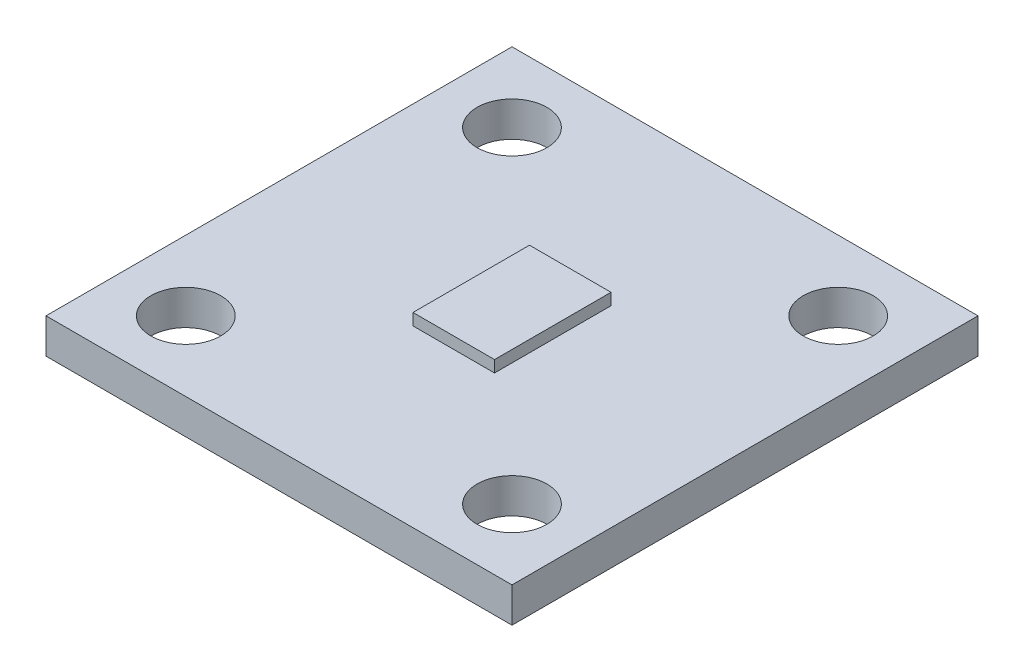
ISO-10303-21;
HEADER;
FILE_DESCRIPTION(('STEP AP214'),'2;1');
FILE_NAME('part.step','',(''),(''),'','','');
FILE_SCHEMA(('AUTOMOTIVE_DESIGN { 1 0 10303 214 1 1 1 1 }'));
ENDSEC;
DATA;
#1=APPLICATION_CONTEXT('core data for automotive mechanical design processes');
#2=APPLICATION_PROTOCOL_DEFINITION('international standard','automotive_design',2000,#1);
#3=PRODUCT_CONTEXT('',#1,'mechanical');
#4=PRODUCT('Part','Part','',(#3));
#5=PRODUCT_RELATED_PRODUCT_CATEGORY('part','',(#4));
#6=PRODUCT_DEFINITION_FORMATION('','',#4);
#7=PRODUCT_DEFINITION_CONTEXT('part definition',#1,'design');
#8=PRODUCT_DEFINITION('design','',#6,#7);
#9=PRODUCT_DEFINITION_SHAPE('','',#8);
#10=(LENGTH_UNIT() NAMED_UNIT(*) SI_UNIT(.MILLI.,.METRE.));
#11=(NAMED_UNIT(*) PLANE_ANGLE_UNIT() SI_UNIT($,.RADIAN.));
#12=(NAMED_UNIT(*) SI_UNIT($,.STERADIAN.) SOLID_ANGLE_UNIT());
#13=UNCERTAINTY_MEASURE_WITH_UNIT(LENGTH_MEASURE(1.E-05),#10,'distance_accuracy_value','');
#14=(GEOMETRIC_REPRESENTATION_CONTEXT(3) GLOBAL_UNCERTAINTY_ASSIGNED_CONTEXT((#13)) GLOBAL_UNIT_ASSIGNED_CONTEXT((#10,
#11,#12)) REPRESENTATION_CONTEXT('',''));
#15=CARTESIAN_POINT('',(0.,0.,0.));
#16=DIRECTION('',(0.,0.,1.));
#17=DIRECTION('',(1.,0.,0.));
#18=AXIS2_PLACEMENT_3D('',#15,#16,#17);
#19=CARTESIAN_POINT('',(0.,1.5,0.));
#20=DIRECTION('',(0.,-1.,0.));
#21=DIRECTION('',(0.,0.,-1.));
#22=AXIS2_PLACEMENT_3D('',#19,#20,#21);
#23=PLANE('',#22);
#24=CARTESIAN_POINT('',(3.,1.5,-3.));
#25=DIRECTION('',(0.,1.,0.));
#26=DIRECTION('',(0.,0.,-1.));
#27=AXIS2_PLACEMENT_3D('',#24,#25,#26);
#28=CIRCLE('',#27,1.5);
#29=CARTESIAN_POINT('',(3.,1.5,-4.5));
#30=VERTEX_POINT('',#29);
#31=EDGE_CURVE('E137',#30,#30,#28,.T.);
#32=ORIENTED_EDGE('',*,*,#31,.F.);
#33=EDGE_LOOP('',(#32));
#34=FACE_BOUND('',#33,.T.);
#35=CARTESIAN_POINT('',(17.,1.5,-3.));
#36=DIRECTION('',(0.,1.,0.));
#37=DIRECTION('',(0.,0.,1.));
#38=AXIS2_PLACEMENT_3D('',#35,#36,#37);
#39=CIRCLE('',#38,1.5);
#40=CARTESIAN_POINT('',(17.,1.5,-1.5));
#41=VERTEX_POINT('',#40);
#42=EDGE_CURVE('E146',#41,#41,#39,.T.);
#43=ORIENTED_EDGE('',*,*,#42,.F.);
#44=EDGE_LOOP('',(#43));
#45=FACE_BOUND('',#44,.T.);
#46=CARTESIAN_POINT('',(17.,1.5,-17.));
#47=DIRECTION('',(0.,1.,0.));
#48=DIRECTION('',(0.,0.,-1.));
#49=AXIS2_PLACEMENT_3D('',#46,#47,#48);
#50=CIRCLE('',#49,1.5);
#51=CARTESIAN_POINT('',(17.,1.5,-18.5));
#52=VERTEX_POINT('',#51);
#53=EDGE_CURVE('E160',#52,#52,#50,.T.);
#54=ORIENTED_EDGE('',*,*,#53,.F.);
#55=EDGE_LOOP('',(#54));
#56=FACE_BOUND('',#55,.T.);
#57=CARTESIAN_POINT('',(3.,1.5,-17.));
#58=DIRECTION('',(0.,1.,0.));
#59=DIRECTION('',(0.,0.,1.));
#60=AXIS2_PLACEMENT_3D('',#57,#58,#59);
#61=CIRCLE('',#60,1.5);
#62=CARTESIAN_POINT('',(3.,1.5,-15.5));
#63=VERTEX_POINT('',#62);
#64=EDGE_CURVE('E164',#63,#63,#61,.T.);
#65=ORIENTED_EDGE('',*,*,#64,.F.);
#66=EDGE_LOOP('',(#65));
#67=FACE_BOUND('',#66,.T.);
#68=DIRECTION('',(0.,0.,1.));
#69=VECTOR('',#68,1.);
#70=CARTESIAN_POINT('',(0.,1.5,0.));
#71=LINE('',#70,#69);
#72=CARTESIAN_POINT('',(0.,1.5,-20.));
#73=VERTEX_POINT('',#72);
#74=CARTESIAN_POINT('',(0.,1.5,0.));
#75=VERTEX_POINT('',#74);
#76=EDGE_CURVE('E171',#73,#75,#71,.T.);
#77=ORIENTED_EDGE('',*,*,#76,.T.);
#78=DIRECTION('',(1.,0.,0.));
#79=VECTOR('',#78,1.);
#80=CARTESIAN_POINT('',(0.,1.5,0.));
#81=LINE('',#80,#79);
#82=CARTESIAN_POINT('',(20.,1.5,0.));
#83=VERTEX_POINT('',#82);
#84=EDGE_CURVE('E180',#75,#83,#81,.T.);
#85=ORIENTED_EDGE('',*,*,#84,.T.);
#86=DIRECTION('',(0.,0.,-1.));
#87=VECTOR('',#86,1.);
#88=CARTESIAN_POINT('',(20.,1.5,0.));
#89=LINE('',#88,#87);
#90=CARTESIAN_POINT('',(20.,1.5,-20.));
#91=VERTEX_POINT('',#90);
#92=EDGE_CURVE('E181',#83,#91,#89,.T.);
#93=ORIENTED_EDGE('',*,*,#92,.T.);
#94=DIRECTION('',(-1.,0.,0.));
#95=VECTOR('',#94,1.);
#96=CARTESIAN_POINT('',(0.,1.5,-20.));
#97=LINE('',#96,#95);
#98=EDGE_CURVE('E182',#91,#73,#97,.T.);
#99=ORIENTED_EDGE('',*,*,#98,.T.);
#100=EDGE_LOOP('',(#77,#85,#93,#99));
#101=FACE_BOUND('',#100,.T.);
#102=DIRECTION('',(0.,0.,1.));
#103=VECTOR('',#102,1.);
#104=CARTESIAN_POINT('',(8.25,1.5,-12.5));
#105=LINE('',#104,#103);
#106=CARTESIAN_POINT('',(8.25,1.5,-12.5));
#107=VERTEX_POINT('',#106);
#108=CARTESIAN_POINT('',(8.25,1.5,-7.5));
#109=VERTEX_POINT('',#108);
#110=EDGE_CURVE('E63',#107,#109,#105,.T.);
#111=ORIENTED_EDGE('',*,*,#110,.F.);
#112=DIRECTION('',(-1.,0.,0.));
#113=VECTOR('',#112,1.);
#114=CARTESIAN_POINT('',(8.25,1.5,-12.5));
#115=LINE('',#114,#113);
#116=CARTESIAN_POINT('',(11.75,1.5,-12.5));
#117=VERTEX_POINT('',#116);
#118=EDGE_CURVE('E64',#117,#107,#115,.T.);
#119=ORIENTED_EDGE('',*,*,#118,.F.);
#120=DIRECTION('',(0.,0.,-1.));
#121=VECTOR('',#120,1.);
#122=CARTESIAN_POINT('',(11.75,1.5,-12.5));
#123=LINE('',#122,#121);
#124=CARTESIAN_POINT('',(11.75,1.5,-7.5));
#125=VERTEX_POINT('',#124);
#126=EDGE_CURVE('E375',#125,#117,#123,.T.);
#127=ORIENTED_EDGE('',*,*,#126,.F.);
#128=DIRECTION('',(1.,0.,0.));
#129=VECTOR('',#128,1.);
#130=CARTESIAN_POINT('',(8.25,1.5,-7.5));
#131=LINE('',#130,#129);
#132=EDGE_CURVE('E385',#109,#125,#131,.T.);
#133=ORIENTED_EDGE('',*,*,#132,.F.);
#134=EDGE_LOOP('',(#111,#119,#127,#133));
#135=FACE_BOUND('',#134,.T.);
#136=ADVANCED_FACE('F44',(#34,#45,#56,#67,#101,#135),#23,.F.);
#137=CARTESIAN_POINT('',(0.,0.,0.));
#138=DIRECTION('',(0.,-1.,0.));
#139=DIRECTION('',(0.,0.,-1.));
#140=AXIS2_PLACEMENT_3D('',#137,#138,#139);
#141=PLANE('',#140);
#142=CARTESIAN_POINT('',(17.,0.,-3.));
#143=DIRECTION('',(0.,1.,0.));
#144=DIRECTION('',(0.,0.,1.));
#145=AXIS2_PLACEMENT_3D('',#142,#143,#144);
#146=CIRCLE('',#145,1.5);
#147=CARTESIAN_POINT('',(17.,0.,-1.5));
#148=VERTEX_POINT('',#147);
#149=EDGE_CURVE('E150',#148,#148,#146,.T.);
#150=ORIENTED_EDGE('',*,*,#149,.T.);
#151=EDGE_LOOP('',(#150));
#152=FACE_BOUND('',#151,.T.);
#153=CARTESIAN_POINT('',(3.,0.,-17.));
#154=DIRECTION('',(0.,1.,0.));
#155=DIRECTION('',(0.,0.,1.));
#156=AXIS2_PLACEMENT_3D('',#153,#154,#155);
#157=CIRCLE('',#156,1.5);
#158=CARTESIAN_POINT('',(3.,0.,-15.5));
#159=VERTEX_POINT('',#158);
#160=EDGE_CURVE('E163',#159,#159,#157,.T.);
#161=ORIENTED_EDGE('',*,*,#160,.T.);
#162=EDGE_LOOP('',(#161));
#163=FACE_BOUND('',#162,.T.);
#164=DIRECTION('',(0.,0.,1.));
#165=VECTOR('',#164,1.);
#166=CARTESIAN_POINT('',(0.,0.,0.));
#167=LINE('',#166,#165);
#168=CARTESIAN_POINT('',(0.,0.,-20.));
#169=VERTEX_POINT('',#168);
#170=CARTESIAN_POINT('',(0.,0.,0.));
#171=VERTEX_POINT('',#170);
#172=EDGE_CURVE('E170',#169,#171,#167,.T.);
#173=ORIENTED_EDGE('',*,*,#172,.F.);
#174=DIRECTION('',(-1.,0.,0.));
#175=VECTOR('',#174,1.);
#176=CARTESIAN_POINT('',(0.,0.,-20.));
#177=LINE('',#176,#175);
#178=CARTESIAN_POINT('',(20.,0.,-20.));
#179=VERTEX_POINT('',#178);
#180=EDGE_CURVE('E178',#179,#169,#177,.T.);
#181=ORIENTED_EDGE('',*,*,#180,.F.);
#182=DIRECTION('',(0.,0.,-1.));
#183=VECTOR('',#182,1.);
#184=CARTESIAN_POINT('',(20.,0.,0.));
#185=LINE('',#184,#183);
#186=CARTESIAN_POINT('',(20.,0.,0.));
#187=VERTEX_POINT('',#186);
#188=EDGE_CURVE('E191',#187,#179,#185,.T.);
#189=ORIENTED_EDGE('',*,*,#188,.F.);
#190=DIRECTION('',(1.,0.,0.));
#191=VECTOR('',#190,1.);
#192=CARTESIAN_POINT('',(0.,0.,0.));
#193=LINE('',#192,#191);
#194=EDGE_CURVE('E192',#171,#187,#193,.T.);
#195=ORIENTED_EDGE('',*,*,#194,.F.);
#196=EDGE_LOOP('',(#173,#181,#189,#195));
#197=FACE_BOUND('',#196,.T.);
#198=CARTESIAN_POINT('',(17.,0.,-17.));
#199=DIRECTION('',(0.,1.,0.));
#200=DIRECTION('',(0.,0.,-1.));
#201=AXIS2_PLACEMENT_3D('',#198,#199,#200);
#202=CIRCLE('',#201,1.5);
#203=CARTESIAN_POINT('',(17.,0.,-18.5));
#204=VERTEX_POINT('',#203);
#205=EDGE_CURVE('E151',#204,#204,#202,.T.);
#206=ORIENTED_EDGE('',*,*,#205,.T.);
#207=EDGE_LOOP('',(#206));
#208=FACE_BOUND('',#207,.T.);
#209=CARTESIAN_POINT('',(3.,0.,-3.));
#210=DIRECTION('',(0.,1.,0.));
#211=DIRECTION('',(0.,0.,-1.));
#212=AXIS2_PLACEMENT_3D('',#209,#210,#211);
#213=CIRCLE('',#212,1.5);
#214=CARTESIAN_POINT('',(3.,0.,-4.5));
#215=VERTEX_POINT('',#214);
#216=EDGE_CURVE('E132',#215,#215,#213,.T.);
#217=ORIENTED_EDGE('',*,*,#216,.T.);
#218=EDGE_LOOP('',(#217));
#219=FACE_BOUND('',#218,.T.);
#220=ADVANCED_FACE('F220',(#152,#163,#197,#208,#219),#141,.T.);
#221=CARTESIAN_POINT('',(0.,1.5,0.));
#222=DIRECTION('',(1.,0.,0.));
#223=DIRECTION('',(0.,0.,-1.));
#224=AXIS2_PLACEMENT_3D('',#221,#222,#223);
#225=PLANE('',#224);
#226=ORIENTED_EDGE('',*,*,#172,.T.);
#227=DIRECTION('',(0.,-1.,0.));
#228=VECTOR('',#227,1.);
#229=CARTESIAN_POINT('',(0.,1.5,0.));
#230=LINE('',#229,#228);
#231=EDGE_CURVE('E11',#75,#171,#230,.T.);
#232=ORIENTED_EDGE('',*,*,#231,.F.);
#233=ORIENTED_EDGE('',*,*,#76,.F.);
#234=DIRECTION('',(0.,-1.,0.));
#235=VECTOR('',#234,1.);
#236=CARTESIAN_POINT('',(0.,1.5,-20.));
#237=LINE('',#236,#235);
#238=EDGE_CURVE('E190',#73,#169,#237,.T.);
#239=ORIENTED_EDGE('',*,*,#238,.T.);
#240=EDGE_LOOP('',(#226,#232,#233,#239));
#241=FACE_BOUND('',#240,.T.);
#242=ADVANCED_FACE('F50',(#241),#225,.F.);
#243=CARTESIAN_POINT('',(0.,1.5,0.));
#244=DIRECTION('',(0.,0.,-1.));
#245=DIRECTION('',(-1.,0.,0.));
#246=AXIS2_PLACEMENT_3D('',#243,#244,#245);
#247=PLANE('',#246);
#248=ORIENTED_EDGE('',*,*,#194,.T.);
#249=DIRECTION('',(0.,-1.,0.));
#250=VECTOR('',#249,1.);
#251=CARTESIAN_POINT('',(20.,1.5,0.));
#252=LINE('',#251,#250);
#253=EDGE_CURVE('E53',#83,#187,#252,.T.);
#254=ORIENTED_EDGE('',*,*,#253,.F.);
#255=ORIENTED_EDGE('',*,*,#84,.F.);
#256=ORIENTED_EDGE('',*,*,#231,.T.);
#257=EDGE_LOOP('',(#248,#254,#255,#256));
#258=FACE_BOUND('',#257,.T.);
#259=ADVANCED_FACE('F230',(#258),#247,.F.);
#260=CARTESIAN_POINT('',(20.,1.5,0.));
#261=DIRECTION('',(-1.,0.,0.));
#262=DIRECTION('',(0.,0.,1.));
#263=AXIS2_PLACEMENT_3D('',#260,#261,#262);
#264=PLANE('',#263);
#265=ORIENTED_EDGE('',*,*,#188,.T.);
#266=DIRECTION('',(0.,-1.,0.));
#267=VECTOR('',#266,1.);
#268=CARTESIAN_POINT('',(20.,1.5,-20.));
#269=LINE('',#268,#267);
#270=EDGE_CURVE('E205',#91,#179,#269,.T.);
#271=ORIENTED_EDGE('',*,*,#270,.F.);
#272=ORIENTED_EDGE('',*,*,#92,.F.);
#273=ORIENTED_EDGE('',*,*,#253,.T.);
#274=EDGE_LOOP('',(#265,#271,#272,#273));
#275=FACE_BOUND('',#274,.T.);
#276=ADVANCED_FACE('F213',(#275),#264,.F.);
#277=CARTESIAN_POINT('',(0.,1.5,-20.));
#278=DIRECTION('',(0.,0.,1.));
#279=DIRECTION('',(1.,0.,0.));
#280=AXIS2_PLACEMENT_3D('',#277,#278,#279);
#281=PLANE('',#280);
#282=ORIENTED_EDGE('',*,*,#180,.T.);
#283=ORIENTED_EDGE('',*,*,#238,.F.);
#284=ORIENTED_EDGE('',*,*,#98,.F.);
#285=ORIENTED_EDGE('',*,*,#270,.T.);
#286=EDGE_LOOP('',(#282,#283,#284,#285));
#287=FACE_BOUND('',#286,.T.);
#288=ADVANCED_FACE('F221',(#287),#281,.F.);
#289=CARTESIAN_POINT('',(3.,1.5,-17.));
#290=DIRECTION('',(0.,-1.,0.));
#291=DIRECTION('',(0.,0.,-1.));
#292=AXIS2_PLACEMENT_3D('',#289,#290,#291);
#293=CYLINDRICAL_SURFACE('',#292,1.5);
#294=ORIENTED_EDGE('',*,*,#64,.T.);
#295=EDGE_LOOP('',(#294));
#296=FACE_BOUND('',#295,.T.);
#297=ORIENTED_EDGE('',*,*,#160,.F.);
#298=EDGE_LOOP('',(#297));
#299=FACE_BOUND('',#298,.T.);
#300=ADVANCED_FACE('F250',(#296,#299),#293,.F.);
#301=CARTESIAN_POINT('',(17.,1.5,-17.));
#302=DIRECTION('',(0.,-1.,0.));
#303=DIRECTION('',(0.,0.,-1.));
#304=AXIS2_PLACEMENT_3D('',#301,#302,#303);
#305=CYLINDRICAL_SURFACE('',#304,1.5);
#306=ORIENTED_EDGE('',*,*,#53,.T.);
#307=EDGE_LOOP('',(#306));
#308=FACE_BOUND('',#307,.T.);
#309=ORIENTED_EDGE('',*,*,#205,.F.);
#310=EDGE_LOOP('',(#309));
#311=FACE_BOUND('',#310,.T.);
#312=ADVANCED_FACE('F252',(#308,#311),#305,.F.);
#313=CARTESIAN_POINT('',(17.,1.5,-3.));
#314=DIRECTION('',(0.,-1.,0.));
#315=DIRECTION('',(0.,0.,-1.));
#316=AXIS2_PLACEMENT_3D('',#313,#314,#315);
#317=CYLINDRICAL_SURFACE('',#316,1.5);
#318=ORIENTED_EDGE('',*,*,#42,.T.);
#319=EDGE_LOOP('',(#318));
#320=FACE_BOUND('',#319,.T.);
#321=ORIENTED_EDGE('',*,*,#149,.F.);
#322=EDGE_LOOP('',(#321));
#323=FACE_BOUND('',#322,.T.);
#324=ADVANCED_FACE('F260',(#320,#323),#317,.F.);
#325=CARTESIAN_POINT('',(3.,1.5,-3.));
#326=DIRECTION('',(0.,-1.,0.));
#327=DIRECTION('',(0.,0.,-1.));
#328=AXIS2_PLACEMENT_3D('',#325,#326,#327);
#329=CYLINDRICAL_SURFACE('',#328,1.5);
#330=ORIENTED_EDGE('',*,*,#31,.T.);
#331=EDGE_LOOP('',(#330));
#332=FACE_BOUND('',#331,.T.);
#333=ORIENTED_EDGE('',*,*,#216,.F.);
#334=EDGE_LOOP('',(#333));
#335=FACE_BOUND('',#334,.T.);
#336=ADVANCED_FACE('F267',(#332,#335),#329,.F.);
#337=CARTESIAN_POINT('',(8.25,2.,-12.5));
#338=DIRECTION('',(1.,0.,0.));
#339=DIRECTION('',(0.,0.,-1.));
#340=AXIS2_PLACEMENT_3D('',#337,#338,#339);
#341=PLANE('',#340);
#342=ORIENTED_EDGE('',*,*,#110,.T.);
#343=DIRECTION('',(0.,-1.,0.));
#344=VECTOR('',#343,1.);
#345=CARTESIAN_POINT('',(8.25,2.,-7.5));
#346=LINE('',#345,#344);
#347=CARTESIAN_POINT('',(8.25,2.,-7.5));
#348=VERTEX_POINT('',#347);
#349=EDGE_CURVE('E114',#348,#109,#346,.T.);
#350=ORIENTED_EDGE('',*,*,#349,.F.);
#351=DIRECTION('',(0.,0.,1.));
#352=VECTOR('',#351,1.);
#353=CARTESIAN_POINT('',(8.25,2.,-12.5));
#354=LINE('',#353,#352);
#355=CARTESIAN_POINT('',(8.25,2.,-12.5));
#356=VERTEX_POINT('',#355);
#357=EDGE_CURVE('E123',#356,#348,#354,.T.);
#358=ORIENTED_EDGE('',*,*,#357,.F.);
#359=DIRECTION('',(0.,-1.,0.));
#360=VECTOR('',#359,1.);
#361=CARTESIAN_POINT('',(8.25,2.,-12.5));
#362=LINE('',#361,#360);
#363=EDGE_CURVE('E368',#356,#107,#362,.T.);
#364=ORIENTED_EDGE('',*,*,#363,.T.);
#365=EDGE_LOOP('',(#342,#350,#358,#364));
#366=FACE_BOUND('',#365,.T.);
#367=ADVANCED_FACE('F135',(#366),#341,.F.);
#368=CARTESIAN_POINT('',(8.25,2.,-7.5));
#369=DIRECTION('',(0.,0.,-1.));
#370=DIRECTION('',(-1.,0.,0.));
#371=AXIS2_PLACEMENT_3D('',#368,#369,#370);
#372=PLANE('',#371);
#373=ORIENTED_EDGE('',*,*,#132,.T.);
#374=DIRECTION('',(0.,-1.,0.));
#375=VECTOR('',#374,1.);
#376=CARTESIAN_POINT('',(11.75,2.,-7.5));
#377=LINE('',#376,#375);
#378=CARTESIAN_POINT('',(11.75,2.,-7.5));
#379=VERTEX_POINT('',#378);
#380=EDGE_CURVE('E118',#379,#125,#377,.T.);
#381=ORIENTED_EDGE('',*,*,#380,.F.);
#382=DIRECTION('',(1.,0.,0.));
#383=VECTOR('',#382,1.);
#384=CARTESIAN_POINT('',(8.25,2.,-7.5));
#385=LINE('',#384,#383);
#386=EDGE_CURVE('E107',#348,#379,#385,.T.);
#387=ORIENTED_EDGE('',*,*,#386,.F.);
#388=ORIENTED_EDGE('',*,*,#349,.T.);
#389=EDGE_LOOP('',(#373,#381,#387,#388));
#390=FACE_BOUND('',#389,.T.);
#391=ADVANCED_FACE('F115',(#390),#372,.F.);
#392=CARTESIAN_POINT('',(11.75,2.,-12.5));
#393=DIRECTION('',(-1.,0.,0.));
#394=DIRECTION('',(0.,0.,1.));
#395=AXIS2_PLACEMENT_3D('',#392,#393,#394);
#396=PLANE('',#395);
#397=ORIENTED_EDGE('',*,*,#126,.T.);
#398=DIRECTION('',(0.,-1.,0.));
#399=VECTOR('',#398,1.);
#400=CARTESIAN_POINT('',(11.75,2.,-12.5));
#401=LINE('',#400,#399);
#402=CARTESIAN_POINT('',(11.75,2.,-12.5));
#403=VERTEX_POINT('',#402);
#404=EDGE_CURVE('E141',#403,#117,#401,.T.);
#405=ORIENTED_EDGE('',*,*,#404,.F.);
#406=DIRECTION('',(0.,0.,-1.));
#407=VECTOR('',#406,1.);
#408=CARTESIAN_POINT('',(11.75,2.,-12.5));
#409=LINE('',#408,#407);
#410=EDGE_CURVE('E119',#379,#403,#409,.T.);
#411=ORIENTED_EDGE('',*,*,#410,.F.);
#412=ORIENTED_EDGE('',*,*,#380,.T.);
#413=EDGE_LOOP('',(#397,#405,#411,#412));
#414=FACE_BOUND('',#413,.T.);
#415=ADVANCED_FACE('F278',(#414),#396,.F.);
#416=CARTESIAN_POINT('',(8.25,2.,-12.5));
#417=DIRECTION('',(0.,0.,1.));
#418=DIRECTION('',(1.,0.,0.));
#419=AXIS2_PLACEMENT_3D('',#416,#417,#418);
#420=PLANE('',#419);
#421=ORIENTED_EDGE('',*,*,#118,.T.);
#422=ORIENTED_EDGE('',*,*,#363,.F.);
#423=DIRECTION('',(-1.,0.,0.));
#424=VECTOR('',#423,1.);
#425=CARTESIAN_POINT('',(8.25,2.,-12.5));
#426=LINE('',#425,#424);
#427=EDGE_CURVE('E128',#403,#356,#426,.T.);
#428=ORIENTED_EDGE('',*,*,#427,.F.);
#429=ORIENTED_EDGE('',*,*,#404,.T.);
#430=EDGE_LOOP('',(#421,#422,#428,#429));
#431=FACE_BOUND('',#430,.T.);
#432=ADVANCED_FACE('F285',(#431),#420,.F.);
#433=CARTESIAN_POINT('',(0.,2.,0.));
#434=DIRECTION('',(0.,1.,0.));
#435=DIRECTION('',(0.,0.,1.));
#436=AXIS2_PLACEMENT_3D('',#433,#434,#435);
#437=PLANE('',#436);
#438=ORIENTED_EDGE('',*,*,#357,.T.);
#439=ORIENTED_EDGE('',*,*,#386,.T.);
#440=ORIENTED_EDGE('',*,*,#410,.T.);
#441=ORIENTED_EDGE('',*,*,#427,.T.);
#442=EDGE_LOOP('',(#438,#439,#440,#441));
#443=FACE_BOUND('',#442,.T.);
#444=ADVANCED_FACE('F125',(#443),#437,.T.);
#445=CLOSED_SHELL('',(#136,#220,#242,#259,#276,#288,#300,#312,#324,#336,#367,#391,#415,#432,#444));
#446=MANIFOLD_SOLID_BREP('B2',#445);
#447=ADVANCED_BREP_SHAPE_REPRESENTATION('',(#18,#446),#14);
#448=SHAPE_DEFINITION_REPRESENTATION(#9,#447);
ENDSEC;
END-ISO-10303-21;
